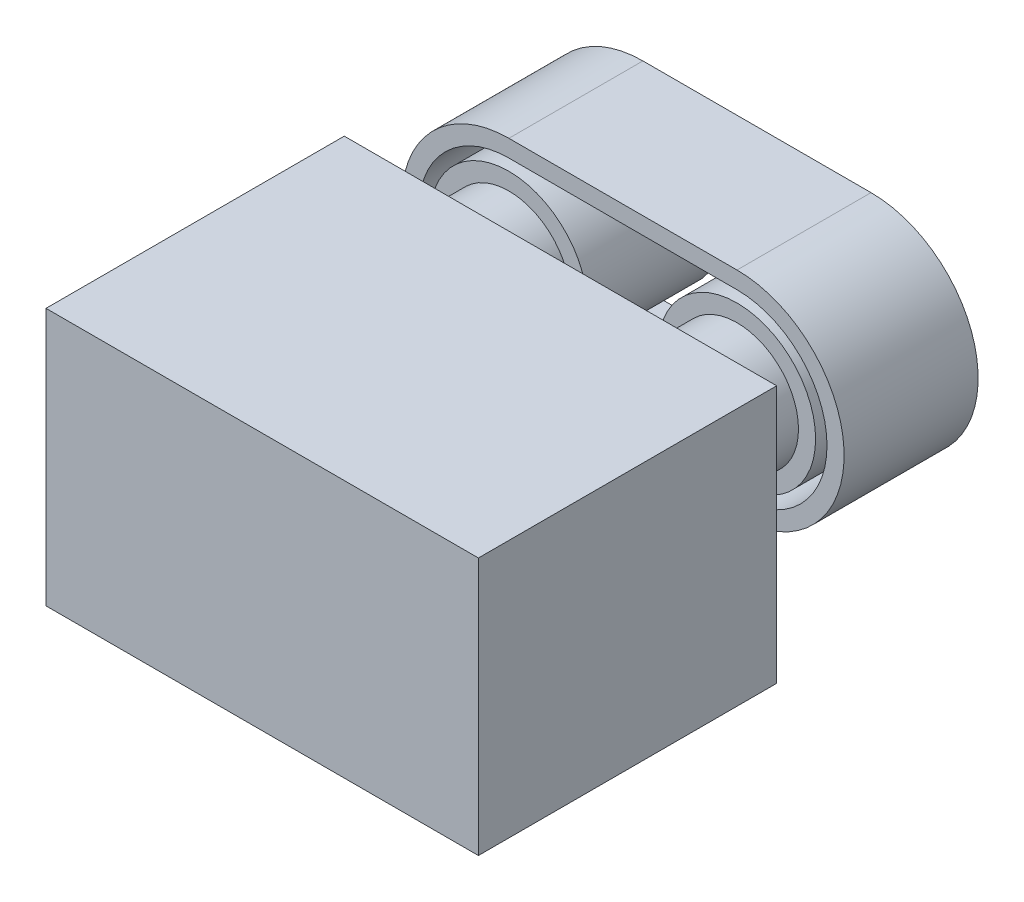
ISO-10303-21;
HEADER;
FILE_DESCRIPTION(('STEP AP214'),'2;1');
FILE_NAME('part.step','',(''),(''),'','','');
FILE_SCHEMA(('AUTOMOTIVE_DESIGN { 1 0 10303 214 1 1 1 1 }'));
ENDSEC;
DATA;
#1=APPLICATION_CONTEXT('core data for automotive mechanical design processes');
#2=APPLICATION_PROTOCOL_DEFINITION('international standard','automotive_design',2000,#1);
#3=PRODUCT_CONTEXT('',#1,'mechanical');
#4=PRODUCT('Part','Part','',(#3));
#5=PRODUCT_RELATED_PRODUCT_CATEGORY('part','',(#4));
#6=PRODUCT_DEFINITION_FORMATION('','',#4);
#7=PRODUCT_DEFINITION_CONTEXT('part definition',#1,'design');
#8=PRODUCT_DEFINITION('design','',#6,#7);
#9=PRODUCT_DEFINITION_SHAPE('','',#8);
#10=(LENGTH_UNIT() NAMED_UNIT(*) SI_UNIT(.MILLI.,.METRE.));
#11=(NAMED_UNIT(*) PLANE_ANGLE_UNIT() SI_UNIT($,.RADIAN.));
#12=(NAMED_UNIT(*) SI_UNIT($,.STERADIAN.) SOLID_ANGLE_UNIT());
#13=UNCERTAINTY_MEASURE_WITH_UNIT(LENGTH_MEASURE(1.E-05),#10,'distance_accuracy_value','');
#14=(GEOMETRIC_REPRESENTATION_CONTEXT(3) GLOBAL_UNCERTAINTY_ASSIGNED_CONTEXT((#13)) GLOBAL_UNIT_ASSIGNED_CONTEXT((#10,
#11,#12)) REPRESENTATION_CONTEXT('',''));
#15=CARTESIAN_POINT('',(0.,0.,0.));
#16=DIRECTION('',(0.,0.,1.));
#17=DIRECTION('',(1.,0.,0.));
#18=AXIS2_PLACEMENT_3D('',#15,#16,#17);
#19=CARTESIAN_POINT('',(129.580947854608,0.,59.69));
#20=DIRECTION('',(0.,0.,1.));
#21=DIRECTION('',(1.,0.,0.));
#22=AXIS2_PLACEMENT_3D('',#19,#20,#21);
#23=PLANE('',#22);
#24=CARTESIAN_POINT('',(129.580947854608,0.,59.69));
#25=DIRECTION('',(0.,0.,1.));
#26=DIRECTION('',(1.,0.,0.));
#27=AXIS2_PLACEMENT_3D('',#24,#25,#26);
#28=CIRCLE('',#27,47.7);
#29=CARTESIAN_POINT('',(129.580947854608,-47.7000000000001,59.69));
#30=VERTEX_POINT('',#29);
#31=CARTESIAN_POINT('',(129.580947854608,47.7,59.69));
#32=VERTEX_POINT('',#31);
#33=EDGE_CURVE('E146',#30,#32,#28,.T.);
#34=ORIENTED_EDGE('',*,*,#33,.T.);
#35=DIRECTION('',(-1.,0.,0.));
#36=VECTOR('',#35,1.);
#37=CARTESIAN_POINT('',(27.9809478546076,47.7,59.69));
#38=LINE('',#37,#36);
#39=CARTESIAN_POINT('',(27.9809478546076,47.7,59.69));
#40=VERTEX_POINT('',#39);
#41=EDGE_CURVE('E149',#32,#40,#38,.T.);
#42=ORIENTED_EDGE('',*,*,#41,.T.);
#43=CARTESIAN_POINT('',(27.9809478546076,0.,59.69));
#44=DIRECTION('',(0.,0.,1.));
#45=DIRECTION('',(1.,0.,0.));
#46=AXIS2_PLACEMENT_3D('',#43,#44,#45);
#47=CIRCLE('',#46,47.7);
#48=CARTESIAN_POINT('',(27.9809478546076,-47.7000000000001,59.69));
#49=VERTEX_POINT('',#48);
#50=EDGE_CURVE('E152',#40,#49,#47,.T.);
#51=ORIENTED_EDGE('',*,*,#50,.T.);
#52=DIRECTION('',(1.,0.,0.));
#53=VECTOR('',#52,1.);
#54=CARTESIAN_POINT('',(27.9809478546076,-47.7000000000001,59.69));
#55=LINE('',#54,#53);
#56=EDGE_CURVE('E154',#49,#30,#55,.T.);
#57=ORIENTED_EDGE('',*,*,#56,.T.);
#58=EDGE_LOOP('',(#34,#42,#51,#57));
#59=FACE_BOUND('',#58,.T.);
#60=DIRECTION('',(1.,0.,0.));
#61=VECTOR('',#60,1.);
#62=CARTESIAN_POINT('',(27.9809478546076,-40.08,59.69));
#63=LINE('',#62,#61);
#64=CARTESIAN_POINT('',(27.9809478546076,-40.08,59.69));
#65=VERTEX_POINT('',#64);
#66=CARTESIAN_POINT('',(129.580947854608,-40.0800000000001,59.69));
#67=VERTEX_POINT('',#66);
#68=EDGE_CURVE('E118',#65,#67,#63,.T.);
#69=ORIENTED_EDGE('',*,*,#68,.F.);
#70=CARTESIAN_POINT('',(27.9809478546076,0.,59.69));
#71=DIRECTION('',(0.,0.,1.));
#72=DIRECTION('',(1.,0.,0.));
#73=AXIS2_PLACEMENT_3D('',#70,#71,#72);
#74=CIRCLE('',#73,40.08);
#75=CARTESIAN_POINT('',(27.9809478546076,40.08,59.69));
#76=VERTEX_POINT('',#75);
#77=EDGE_CURVE('E110',#76,#65,#74,.T.);
#78=ORIENTED_EDGE('',*,*,#77,.F.);
#79=DIRECTION('',(-1.,0.,0.));
#80=VECTOR('',#79,1.);
#81=CARTESIAN_POINT('',(27.9809478546076,40.08,59.69));
#82=LINE('',#81,#80);
#83=CARTESIAN_POINT('',(129.580947854608,40.08,59.69));
#84=VERTEX_POINT('',#83);
#85=EDGE_CURVE('E132',#84,#76,#82,.T.);
#86=ORIENTED_EDGE('',*,*,#85,.F.);
#87=CARTESIAN_POINT('',(129.580947854608,0.,59.69));
#88=DIRECTION('',(0.,0.,1.));
#89=DIRECTION('',(1.,0.,0.));
#90=AXIS2_PLACEMENT_3D('',#87,#88,#89);
#91=CIRCLE('',#90,40.08);
#92=EDGE_CURVE('E130',#67,#84,#91,.T.);
#93=ORIENTED_EDGE('',*,*,#92,.F.);
#94=EDGE_LOOP('',(#69,#78,#86,#93));
#95=FACE_BOUND('',#94,.T.);
#96=ADVANCED_FACE('F45',(#59,#95),#23,.T.);
#97=CARTESIAN_POINT('',(129.580947854608,0.,0.));
#98=DIRECTION('',(0.,0.,1.));
#99=DIRECTION('',(1.,0.,0.));
#100=AXIS2_PLACEMENT_3D('',#97,#98,#99);
#101=PLANE('',#100);
#102=CARTESIAN_POINT('',(129.580947854608,0.,0.));
#103=DIRECTION('',(0.,0.,1.));
#104=DIRECTION('',(1.,0.,0.));
#105=AXIS2_PLACEMENT_3D('',#102,#103,#104);
#106=CIRCLE('',#105,47.7);
#107=CARTESIAN_POINT('',(129.580947854608,-47.7000000000001,0.));
#108=VERTEX_POINT('',#107);
#109=CARTESIAN_POINT('',(129.580947854608,47.7,0.));
#110=VERTEX_POINT('',#109);
#111=EDGE_CURVE('E126',#108,#110,#106,.T.);
#112=ORIENTED_EDGE('',*,*,#111,.F.);
#113=DIRECTION('',(1.,0.,0.));
#114=VECTOR('',#113,1.);
#115=CARTESIAN_POINT('',(27.9809478546076,-47.7000000000001,0.));
#116=LINE('',#115,#114);
#117=CARTESIAN_POINT('',(27.9809478546076,-47.7000000000001,0.));
#118=VERTEX_POINT('',#117);
#119=EDGE_CURVE('E150',#118,#108,#116,.T.);
#120=ORIENTED_EDGE('',*,*,#119,.F.);
#121=CARTESIAN_POINT('',(27.9809478546076,0.,0.));
#122=DIRECTION('',(0.,0.,1.));
#123=DIRECTION('',(1.,0.,0.));
#124=AXIS2_PLACEMENT_3D('',#121,#122,#123);
#125=CIRCLE('',#124,47.7);
#126=CARTESIAN_POINT('',(27.9809478546076,47.7,0.));
#127=VERTEX_POINT('',#126);
#128=EDGE_CURVE('E161',#127,#118,#125,.T.);
#129=ORIENTED_EDGE('',*,*,#128,.F.);
#130=DIRECTION('',(-1.,0.,0.));
#131=VECTOR('',#130,1.);
#132=CARTESIAN_POINT('',(27.9809478546076,47.7,0.));
#133=LINE('',#132,#131);
#134=EDGE_CURVE('E159',#110,#127,#133,.T.);
#135=ORIENTED_EDGE('',*,*,#134,.F.);
#136=EDGE_LOOP('',(#112,#120,#129,#135));
#137=FACE_BOUND('',#136,.T.);
#138=CARTESIAN_POINT('',(27.9809478546076,0.,0.));
#139=DIRECTION('',(0.,0.,1.));
#140=DIRECTION('',(1.,0.,0.));
#141=AXIS2_PLACEMENT_3D('',#138,#139,#140);
#142=CIRCLE('',#141,40.08);
#143=CARTESIAN_POINT('',(27.9809478546076,40.08,0.));
#144=VERTEX_POINT('',#143);
#145=CARTESIAN_POINT('',(27.9809478546076,-40.08,0.));
#146=VERTEX_POINT('',#145);
#147=EDGE_CURVE('E68',#144,#146,#142,.T.);
#148=ORIENTED_EDGE('',*,*,#147,.T.);
#149=DIRECTION('',(1.,0.,0.));
#150=VECTOR('',#149,1.);
#151=CARTESIAN_POINT('',(27.9809478546076,-40.08,0.));
#152=LINE('',#151,#150);
#153=CARTESIAN_POINT('',(129.580947854608,-40.0800000000001,0.));
#154=VERTEX_POINT('',#153);
#155=EDGE_CURVE('E125',#146,#154,#152,.T.);
#156=ORIENTED_EDGE('',*,*,#155,.T.);
#157=CARTESIAN_POINT('',(129.580947854608,0.,0.));
#158=DIRECTION('',(0.,0.,1.));
#159=DIRECTION('',(1.,0.,0.));
#160=AXIS2_PLACEMENT_3D('',#157,#158,#159);
#161=CIRCLE('',#160,40.08);
#162=CARTESIAN_POINT('',(129.580947854608,40.08,0.));
#163=VERTEX_POINT('',#162);
#164=EDGE_CURVE('E138',#154,#163,#161,.T.);
#165=ORIENTED_EDGE('',*,*,#164,.T.);
#166=DIRECTION('',(-1.,0.,0.));
#167=VECTOR('',#166,1.);
#168=CARTESIAN_POINT('',(27.9809478546076,40.08,0.));
#169=LINE('',#168,#167);
#170=EDGE_CURVE('E119',#163,#144,#169,.T.);
#171=ORIENTED_EDGE('',*,*,#170,.T.);
#172=EDGE_LOOP('',(#148,#156,#165,#171));
#173=FACE_BOUND('',#172,.T.);
#174=ADVANCED_FACE('F179',(#137,#173),#101,.F.);
#175=CARTESIAN_POINT('',(129.580947854608,0.,59.69));
#176=DIRECTION('',(0.,0.,-1.));
#177=DIRECTION('',(-1.,0.,0.));
#178=AXIS2_PLACEMENT_3D('',#175,#176,#177);
#179=CYLINDRICAL_SURFACE('',#178,47.7);
#180=ORIENTED_EDGE('',*,*,#111,.T.);
#181=DIRECTION('',(0.,0.,-1.));
#182=VECTOR('',#181,1.);
#183=CARTESIAN_POINT('',(129.580947854608,47.7,59.69));
#184=LINE('',#183,#182);
#185=EDGE_CURVE('E12',#32,#110,#184,.T.);
#186=ORIENTED_EDGE('',*,*,#185,.F.);
#187=ORIENTED_EDGE('',*,*,#33,.F.);
#188=DIRECTION('',(0.,0.,-1.));
#189=VECTOR('',#188,1.);
#190=CARTESIAN_POINT('',(129.580947854608,-47.7000000000001,59.69));
#191=LINE('',#190,#189);
#192=EDGE_CURVE('E156',#30,#108,#191,.T.);
#193=ORIENTED_EDGE('',*,*,#192,.T.);
#194=EDGE_LOOP('',(#180,#186,#187,#193));
#195=FACE_BOUND('',#194,.T.);
#196=ADVANCED_FACE('F47',(#195),#179,.T.);
#197=CARTESIAN_POINT('',(27.9809478546076,47.7,59.69));
#198=DIRECTION('',(0.,-1.,0.));
#199=DIRECTION('',(1.,0.,0.));
#200=AXIS2_PLACEMENT_3D('',#197,#198,#199);
#201=PLANE('',#200);
#202=ORIENTED_EDGE('',*,*,#134,.T.);
#203=DIRECTION('',(0.,0.,-1.));
#204=VECTOR('',#203,1.);
#205=CARTESIAN_POINT('',(27.9809478546076,47.7,59.69));
#206=LINE('',#205,#204);
#207=EDGE_CURVE('E53',#40,#127,#206,.T.);
#208=ORIENTED_EDGE('',*,*,#207,.F.);
#209=ORIENTED_EDGE('',*,*,#41,.F.);
#210=ORIENTED_EDGE('',*,*,#185,.T.);
#211=EDGE_LOOP('',(#202,#208,#209,#210));
#212=FACE_BOUND('',#211,.T.);
#213=ADVANCED_FACE('F189',(#212),#201,.F.);
#214=CARTESIAN_POINT('',(27.9809478546076,0.,59.69));
#215=DIRECTION('',(0.,0.,-1.));
#216=DIRECTION('',(-1.,0.,0.));
#217=AXIS2_PLACEMENT_3D('',#214,#215,#216);
#218=CYLINDRICAL_SURFACE('',#217,47.7);
#219=ORIENTED_EDGE('',*,*,#128,.T.);
#220=DIRECTION('',(0.,0.,-1.));
#221=VECTOR('',#220,1.);
#222=CARTESIAN_POINT('',(27.9809478546076,-47.7000000000001,59.69));
#223=LINE('',#222,#221);
#224=EDGE_CURVE('E166',#49,#118,#223,.T.);
#225=ORIENTED_EDGE('',*,*,#224,.F.);
#226=ORIENTED_EDGE('',*,*,#50,.F.);
#227=ORIENTED_EDGE('',*,*,#207,.T.);
#228=EDGE_LOOP('',(#219,#225,#226,#227));
#229=FACE_BOUND('',#228,.T.);
#230=ADVANCED_FACE('F173',(#229),#218,.T.);
#231=CARTESIAN_POINT('',(27.9809478546076,-47.7000000000001,59.69));
#232=DIRECTION('',(0.,1.,0.));
#233=DIRECTION('',(-1.,0.,0.));
#234=AXIS2_PLACEMENT_3D('',#231,#232,#233);
#235=PLANE('',#234);
#236=ORIENTED_EDGE('',*,*,#119,.T.);
#237=ORIENTED_EDGE('',*,*,#192,.F.);
#238=ORIENTED_EDGE('',*,*,#56,.F.);
#239=ORIENTED_EDGE('',*,*,#224,.T.);
#240=EDGE_LOOP('',(#236,#237,#238,#239));
#241=FACE_BOUND('',#240,.T.);
#242=ADVANCED_FACE('F183',(#241),#235,.F.);
#243=CARTESIAN_POINT('',(27.9809478546076,0.,59.69));
#244=DIRECTION('',(0.,0.,-1.));
#245=DIRECTION('',(-1.,0.,0.));
#246=AXIS2_PLACEMENT_3D('',#243,#244,#245);
#247=CYLINDRICAL_SURFACE('',#246,40.08);
#248=ORIENTED_EDGE('',*,*,#147,.F.);
#249=DIRECTION('',(0.,0.,-1.));
#250=VECTOR('',#249,1.);
#251=CARTESIAN_POINT('',(27.9809478546076,40.08,59.69));
#252=LINE('',#251,#250);
#253=EDGE_CURVE('E114',#76,#144,#252,.T.);
#254=ORIENTED_EDGE('',*,*,#253,.F.);
#255=ORIENTED_EDGE('',*,*,#77,.T.);
#256=DIRECTION('',(0.,0.,-1.));
#257=VECTOR('',#256,1.);
#258=CARTESIAN_POINT('',(27.9809478546076,-40.08,59.69));
#259=LINE('',#258,#257);
#260=EDGE_CURVE('E113',#65,#146,#259,.T.);
#261=ORIENTED_EDGE('',*,*,#260,.T.);
#262=EDGE_LOOP('',(#248,#254,#255,#261));
#263=FACE_BOUND('',#262,.T.);
#264=ADVANCED_FACE('F112',(#263),#247,.F.);
#265=CARTESIAN_POINT('',(27.9809478546076,-40.08,59.69));
#266=DIRECTION('',(0.,1.,0.));
#267=DIRECTION('',(-1.,0.,0.));
#268=AXIS2_PLACEMENT_3D('',#265,#266,#267);
#269=PLANE('',#268);
#270=ORIENTED_EDGE('',*,*,#155,.F.);
#271=ORIENTED_EDGE('',*,*,#260,.F.);
#272=ORIENTED_EDGE('',*,*,#68,.T.);
#273=DIRECTION('',(0.,0.,-1.));
#274=VECTOR('',#273,1.);
#275=CARTESIAN_POINT('',(129.580947854608,-40.0800000000001,59.69));
#276=LINE('',#275,#274);
#277=EDGE_CURVE('E127',#67,#154,#276,.T.);
#278=ORIENTED_EDGE('',*,*,#277,.T.);
#279=EDGE_LOOP('',(#270,#271,#272,#278));
#280=FACE_BOUND('',#279,.T.);
#281=ADVANCED_FACE('F122',(#280),#269,.T.);
#282=CARTESIAN_POINT('',(129.580947854608,0.,59.69));
#283=DIRECTION('',(0.,0.,-1.));
#284=DIRECTION('',(-1.,0.,0.));
#285=AXIS2_PLACEMENT_3D('',#282,#283,#284);
#286=CYLINDRICAL_SURFACE('',#285,40.08);
#287=ORIENTED_EDGE('',*,*,#164,.F.);
#288=ORIENTED_EDGE('',*,*,#277,.F.);
#289=ORIENTED_EDGE('',*,*,#92,.T.);
#290=DIRECTION('',(0.,0.,-1.));
#291=VECTOR('',#290,1.);
#292=CARTESIAN_POINT('',(129.580947854608,40.08,59.69));
#293=LINE('',#292,#291);
#294=EDGE_CURVE('E60',#84,#163,#293,.T.);
#295=ORIENTED_EDGE('',*,*,#294,.T.);
#296=EDGE_LOOP('',(#287,#288,#289,#295));
#297=FACE_BOUND('',#296,.T.);
#298=ADVANCED_FACE('F212',(#297),#286,.F.);
#299=CARTESIAN_POINT('',(27.9809478546076,40.08,59.69));
#300=DIRECTION('',(0.,-1.,0.));
#301=DIRECTION('',(1.,0.,0.));
#302=AXIS2_PLACEMENT_3D('',#299,#300,#301);
#303=PLANE('',#302);
#304=ORIENTED_EDGE('',*,*,#170,.F.);
#305=ORIENTED_EDGE('',*,*,#294,.F.);
#306=ORIENTED_EDGE('',*,*,#85,.T.);
#307=ORIENTED_EDGE('',*,*,#253,.T.);
#308=EDGE_LOOP('',(#304,#305,#306,#307));
#309=FACE_BOUND('',#308,.T.);
#310=ADVANCED_FACE('F216',(#309),#303,.T.);
#311=CLOSED_SHELL('',(#96,#174,#196,#213,#230,#242,#264,#281,#298,#310));
#312=MANIFOLD_SOLID_BREP('B2',#311);
#313=CARTESIAN_POINT('',(-112.093411713347,-82.5676000219053,212.852));
#314=DIRECTION('',(0.,1.,0.));
#315=DIRECTION('',(0.,0.,1.));
#316=AXIS2_PLACEMENT_3D('',#313,#314,#315);
#317=PLANE('',#316);
#318=DIRECTION('',(1.,0.,0.));
#319=VECTOR('',#318,1.);
#320=CARTESIAN_POINT('',(-112.093411713347,-82.5676000219053,212.852));
#321=LINE('',#320,#319);
#322=CARTESIAN_POINT('',(-25.0134658406247,-82.5676000219053,212.852));
#323=VERTEX_POINT('',#322);
#324=CARTESIAN_POINT('',(167.571039973753,-82.5676000219053,212.852));
#325=VERTEX_POINT('',#324);
#326=EDGE_CURVE('E329',#323,#325,#321,.T.);
#327=ORIENTED_EDGE('',*,*,#326,.F.);
#328=DIRECTION('',(0.,0.,-1.));
#329=VECTOR('',#328,1.);
#330=CARTESIAN_POINT('',(-25.0134658406247,-82.5676000219053,212.852));
#331=LINE('',#330,#329);
#332=CARTESIAN_POINT('',(-25.0134658406247,-82.5676000219053,80.01));
#333=VERTEX_POINT('',#332);
#334=EDGE_CURVE('E383',#323,#333,#331,.T.);
#335=ORIENTED_EDGE('',*,*,#334,.T.);
#336=DIRECTION('',(1.,0.,0.));
#337=VECTOR('',#336,1.);
#338=CARTESIAN_POINT('',(-112.093411713347,-82.5676000219053,80.01));
#339=LINE('',#338,#337);
#340=CARTESIAN_POINT('',(167.571039973753,-82.5676000219053,80.01));
#341=VERTEX_POINT('',#340);
#342=EDGE_CURVE('E321',#333,#341,#339,.T.);
#343=ORIENTED_EDGE('',*,*,#342,.T.);
#344=DIRECTION('',(0.,0.,-1.));
#345=VECTOR('',#344,1.);
#346=CARTESIAN_POINT('',(167.571039973753,-82.5676000219053,212.852));
#347=LINE('',#346,#345);
#348=EDGE_CURVE('E316',#325,#341,#347,.T.);
#349=ORIENTED_EDGE('',*,*,#348,.F.);
#350=EDGE_LOOP('',(#327,#335,#343,#349));
#351=FACE_BOUND('',#350,.T.);
#352=ADVANCED_FACE('F275',(#351),#317,.F.);
#353=CARTESIAN_POINT('',(167.571039973753,0.,212.852));
#354=DIRECTION('',(-1.,0.,0.));
#355=DIRECTION('',(0.,0.,1.));
#356=AXIS2_PLACEMENT_3D('',#353,#354,#355);
#357=PLANE('',#356);
#358=DIRECTION('',(0.,1.,0.));
#359=VECTOR('',#358,1.);
#360=CARTESIAN_POINT('',(167.571039973753,0.,80.01));
#361=LINE('',#360,#359);
#362=CARTESIAN_POINT('',(167.571039973753,32.2037853457875,80.01));
#363=VERTEX_POINT('',#362);
#364=EDGE_CURVE('E310',#341,#363,#361,.T.);
#365=ORIENTED_EDGE('',*,*,#364,.T.);
#366=DIRECTION('',(0.,0.,-1.));
#367=VECTOR('',#366,1.);
#368=CARTESIAN_POINT('',(167.571039973753,32.2037853457875,212.852));
#369=LINE('',#368,#367);
#370=CARTESIAN_POINT('',(167.571039973753,32.2037853457875,212.852));
#371=VERTEX_POINT('',#370);
#372=EDGE_CURVE('E313',#371,#363,#369,.T.);
#373=ORIENTED_EDGE('',*,*,#372,.F.);
#374=DIRECTION('',(0.,1.,0.));
#375=VECTOR('',#374,1.);
#376=CARTESIAN_POINT('',(167.571039973753,0.,212.852));
#377=LINE('',#376,#375);
#378=EDGE_CURVE('E297',#325,#371,#377,.T.);
#379=ORIENTED_EDGE('',*,*,#378,.F.);
#380=ORIENTED_EDGE('',*,*,#348,.T.);
#381=EDGE_LOOP('',(#365,#373,#379,#380));
#382=FACE_BOUND('',#381,.T.);
#383=ADVANCED_FACE('F312',(#382),#357,.F.);
#384=CARTESIAN_POINT('',(167.571039973753,32.2037853457875,212.852));
#385=DIRECTION('',(0.,-1.,0.));
#386=DIRECTION('',(0.,0.,-1.));
#387=AXIS2_PLACEMENT_3D('',#384,#385,#386);
#388=PLANE('',#387);
#389=DIRECTION('',(-1.,0.,0.));
#390=VECTOR('',#389,1.);
#391=CARTESIAN_POINT('',(167.571039973753,32.2037853457875,80.01));
#392=LINE('',#391,#390);
#393=CARTESIAN_POINT('',(-25.0134658406247,32.2037853457875,80.01));
#394=VERTEX_POINT('',#393);
#395=EDGE_CURVE('E320',#363,#394,#392,.T.);
#396=ORIENTED_EDGE('',*,*,#395,.T.);
#397=DIRECTION('',(0.,0.,1.));
#398=VECTOR('',#397,1.);
#399=CARTESIAN_POINT('',(-25.0134658406247,32.2037853457875,212.852));
#400=LINE('',#399,#398);
#401=CARTESIAN_POINT('',(-25.0134658406247,32.2037853457875,212.852));
#402=VERTEX_POINT('',#401);
#403=EDGE_CURVE('E289',#394,#402,#400,.T.);
#404=ORIENTED_EDGE('',*,*,#403,.T.);
#405=DIRECTION('',(-1.,0.,0.));
#406=VECTOR('',#405,1.);
#407=CARTESIAN_POINT('',(167.571039973753,32.2037853457875,212.852));
#408=LINE('',#407,#406);
#409=EDGE_CURVE('E326',#371,#402,#408,.T.);
#410=ORIENTED_EDGE('',*,*,#409,.F.);
#411=ORIENTED_EDGE('',*,*,#372,.T.);
#412=EDGE_LOOP('',(#396,#404,#410,#411));
#413=FACE_BOUND('',#412,.T.);
#414=ADVANCED_FACE('F325',(#413),#388,.F.);
#415=CARTESIAN_POINT('',(0.,0.,212.852));
#416=DIRECTION('',(0.,0.,1.));
#417=DIRECTION('',(1.,0.,0.));
#418=AXIS2_PLACEMENT_3D('',#415,#416,#417);
#419=PLANE('',#418);
#420=DIRECTION('',(0.,1.,0.));
#421=VECTOR('',#420,1.);
#422=CARTESIAN_POINT('',(-25.0134658406247,0.,212.852));
#423=LINE('',#422,#421);
#424=EDGE_CURVE('E375',#323,#402,#423,.T.);
#425=ORIENTED_EDGE('',*,*,#424,.F.);
#426=ORIENTED_EDGE('',*,*,#326,.T.);
#427=ORIENTED_EDGE('',*,*,#378,.T.);
#428=ORIENTED_EDGE('',*,*,#409,.T.);
#429=EDGE_LOOP('',(#425,#426,#427,#428));
#430=FACE_BOUND('',#429,.T.);
#431=ADVANCED_FACE('F346',(#430),#419,.T.);
#432=CARTESIAN_POINT('',(0.,0.,80.01));
#433=DIRECTION('',(0.,0.,1.));
#434=DIRECTION('',(1.,0.,0.));
#435=AXIS2_PLACEMENT_3D('',#432,#433,#434);
#436=PLANE('',#435);
#437=CARTESIAN_POINT('',(129.580947854608,0.,80.01));
#438=DIRECTION('',(0.,0.,1.));
#439=DIRECTION('',(1.,0.,0.));
#440=AXIS2_PLACEMENT_3D('',#437,#438,#439);
#441=CIRCLE('',#440,27.38);
#442=CARTESIAN_POINT('',(156.960947854608,0.,80.01));
#443=VERTEX_POINT('',#442);
#444=EDGE_CURVE('E282',#443,#443,#441,.F.);
#445=ORIENTED_EDGE('',*,*,#444,.F.);
#446=EDGE_LOOP('',(#445));
#447=FACE_BOUND('',#446,.T.);
#448=CARTESIAN_POINT('',(27.9809478546076,0.,80.01));
#449=DIRECTION('',(0.,0.,1.));
#450=DIRECTION('',(1.,0.,0.));
#451=AXIS2_PLACEMENT_3D('',#448,#449,#450);
#452=CIRCLE('',#451,27.38);
#453=CARTESIAN_POINT('',(55.3609478546076,0.,80.01));
#454=VERTEX_POINT('',#453);
#455=EDGE_CURVE('E335',#454,#454,#452,.F.);
#456=ORIENTED_EDGE('',*,*,#455,.F.);
#457=EDGE_LOOP('',(#456));
#458=FACE_BOUND('',#457,.T.);
#459=ORIENTED_EDGE('',*,*,#342,.F.);
#460=DIRECTION('',(0.,1.,0.));
#461=VECTOR('',#460,1.);
#462=CARTESIAN_POINT('',(-25.0134658406247,0.,80.01));
#463=LINE('',#462,#461);
#464=EDGE_CURVE('E43',#333,#394,#463,.T.);
#465=ORIENTED_EDGE('',*,*,#464,.T.);
#466=ORIENTED_EDGE('',*,*,#395,.F.);
#467=ORIENTED_EDGE('',*,*,#364,.F.);
#468=EDGE_LOOP('',(#459,#465,#466,#467));
#469=FACE_BOUND('',#468,.T.);
#470=ADVANCED_FACE('F328',(#447,#458,#469),#436,.F.);
#471=CARTESIAN_POINT('',(27.9809478546076,0.,59.69));
#472=DIRECTION('',(0.,0.,-1.));
#473=DIRECTION('',(-1.,0.,0.));
#474=AXIS2_PLACEMENT_3D('',#471,#472,#473);
#475=CYLINDRICAL_SURFACE('',#474,35.);
#476=CARTESIAN_POINT('',(27.9809478546076,0.,59.69));
#477=DIRECTION('',(0.,0.,1.));
#478=DIRECTION('',(1.,0.,0.));
#479=AXIS2_PLACEMENT_3D('',#476,#477,#478);
#480=CIRCLE('',#479,35.);
#481=CARTESIAN_POINT('',(-7.01905214539237,0.,59.69));
#482=VERTEX_POINT('',#481);
#483=EDGE_CURVE('E360',#482,#482,#480,.T.);
#484=CARTESIAN_POINT('',(27.9809478546076,0.,0.));
#485=DIRECTION('',(0.,0.,1.));
#486=DIRECTION('',(1.,0.,0.));
#487=AXIS2_PLACEMENT_3D('',#484,#485,#486);
#488=CIRCLE('',#487,35.);
#489=CARTESIAN_POINT('',(-7.01905214539237,0.,0.));
#490=VERTEX_POINT('',#489);
#491=EDGE_CURVE('E363',#490,#490,#488,.T.);
#492=CARTESIAN_POINT('',(-7.01905214539237,0.,59.69));
#493=CARTESIAN_POINT('',(-7.01905214539237,0.,59.0682291666667));
#494=CARTESIAN_POINT('',(-7.01905214539237,0.,58.4464583333333));
#495=CARTESIAN_POINT('',(-7.01905214539237,0.,57.2029166666667));
#496=CARTESIAN_POINT('',(-7.01905214539237,0.,56.5811458333333));
#497=CARTESIAN_POINT('',(-7.01905214539237,0.,55.3376041666667));
#498=CARTESIAN_POINT('',(-7.01905214539237,0.,54.7158333333333));
#499=CARTESIAN_POINT('',(-7.01905214539237,0.,53.4722916666667));
#500=CARTESIAN_POINT('',(-7.01905214539237,0.,52.8505208333333));
#501=CARTESIAN_POINT('',(-7.01905214539237,0.,51.6069791666667));
#502=CARTESIAN_POINT('',(-7.01905214539237,0.,50.9852083333333));
#503=CARTESIAN_POINT('',(-7.01905214539237,0.,49.7416666666667));
#504=CARTESIAN_POINT('',(-7.01905214539237,0.,49.1198958333333));
#505=CARTESIAN_POINT('',(-7.01905214539237,0.,47.8763541666667));
#506=CARTESIAN_POINT('',(-7.01905214539237,0.,47.2545833333333));
#507=CARTESIAN_POINT('',(-7.01905214539237,0.,46.0110416666667));
#508=CARTESIAN_POINT('',(-7.01905214539237,0.,45.3892708333333));
#509=CARTESIAN_POINT('',(-7.01905214539237,0.,44.1457291666667));
#510=CARTESIAN_POINT('',(-7.01905214539237,0.,43.5239583333333));
#511=CARTESIAN_POINT('',(-7.01905214539237,0.,42.2804166666667));
#512=CARTESIAN_POINT('',(-7.01905214539237,0.,41.6586458333333));
#513=CARTESIAN_POINT('',(-7.01905214539237,0.,40.4151041666667));
#514=CARTESIAN_POINT('',(-7.01905214539237,0.,39.7933333333333));
#515=CARTESIAN_POINT('',(-7.01905214539237,0.,38.5497916666667));
#516=CARTESIAN_POINT('',(-7.01905214539237,0.,37.9280208333333));
#517=CARTESIAN_POINT('',(-7.01905214539237,0.,36.6844791666667));
#518=CARTESIAN_POINT('',(-7.01905214539237,0.,36.0627083333333));
#519=CARTESIAN_POINT('',(-7.01905214539237,0.,34.8191666666667));
#520=CARTESIAN_POINT('',(-7.01905214539237,0.,34.1973958333333));
#521=CARTESIAN_POINT('',(-7.01905214539237,0.,32.9538541666667));
#522=CARTESIAN_POINT('',(-7.01905214539237,0.,32.3320833333333));
#523=CARTESIAN_POINT('',(-7.01905214539237,0.,31.0885416666667));
#524=CARTESIAN_POINT('',(-7.01905214539237,0.,30.4667708333333));
#525=CARTESIAN_POINT('',(-7.01905214539237,0.,29.2232291666667));
#526=CARTESIAN_POINT('',(-7.01905214539237,0.,28.6014583333333));
#527=CARTESIAN_POINT('',(-7.01905214539237,0.,27.3579166666667));
#528=CARTESIAN_POINT('',(-7.01905214539237,0.,26.7361458333333));
#529=CARTESIAN_POINT('',(-7.01905214539237,0.,25.4926041666667));
#530=CARTESIAN_POINT('',(-7.01905214539237,0.,24.8708333333333));
#531=CARTESIAN_POINT('',(-7.01905214539237,0.,23.6272916666667));
#532=CARTESIAN_POINT('',(-7.01905214539237,0.,23.0055208333333));
#533=CARTESIAN_POINT('',(-7.01905214539237,0.,21.7619791666667));
#534=CARTESIAN_POINT('',(-7.01905214539237,0.,21.1402083333333));
#535=CARTESIAN_POINT('',(-7.01905214539237,0.,19.8966666666667));
#536=CARTESIAN_POINT('',(-7.01905214539237,0.,19.2748958333333));
#537=CARTESIAN_POINT('',(-7.01905214539237,0.,18.0313541666667));
#538=CARTESIAN_POINT('',(-7.01905214539237,0.,17.4095833333333));
#539=CARTESIAN_POINT('',(-7.01905214539237,0.,16.1660416666667));
#540=CARTESIAN_POINT('',(-7.01905214539237,0.,15.5442708333333));
#541=CARTESIAN_POINT('',(-7.01905214539237,0.,14.3007291666667));
#542=CARTESIAN_POINT('',(-7.01905214539237,0.,13.6789583333333));
#543=CARTESIAN_POINT('',(-7.01905214539237,0.,12.4354166666667));
#544=CARTESIAN_POINT('',(-7.01905214539237,0.,11.8136458333333));
#545=CARTESIAN_POINT('',(-7.01905214539237,0.,10.5701041666667));
#546=CARTESIAN_POINT('',(-7.01905214539237,0.,9.94833333333334));
#547=CARTESIAN_POINT('',(-7.01905214539237,0.,8.70479166666667));
#548=CARTESIAN_POINT('',(-7.01905214539237,0.,8.08302083333334));
#549=CARTESIAN_POINT('',(-7.01905214539237,0.,6.83947916666667));
#550=CARTESIAN_POINT('',(-7.01905214539237,0.,6.21770833333334));
#551=CARTESIAN_POINT('',(-7.01905214539237,0.,4.97416666666667));
#552=CARTESIAN_POINT('',(-7.01905214539237,0.,4.35239583333334));
#553=CARTESIAN_POINT('',(-7.01905214539237,0.,3.10885416666667));
#554=CARTESIAN_POINT('',(-7.01905214539237,0.,2.48708333333333));
#555=CARTESIAN_POINT('',(-7.01905214539237,0.,1.24354166666667));
#556=CARTESIAN_POINT('',(-7.01905214539237,0.,0.621770833333333));
#557=CARTESIAN_POINT('',(-7.01905214539237,0.,0.));
#558=B_SPLINE_CURVE_WITH_KNOTS('',3,(#492,#493,#494,#495,#496,#497,#498,#499,#500,#501,#502,
#503,#504,#505,#506,#507,#508,#509,#510,#511,#512,#513,#514,#515,#516,#517,#518,#519,#520,#521,
#522,#523,#524,#525,#526,#527,#528,#529,#530,#531,#532,#533,#534,#535,#536,#537,#538,#539,#540,
#541,#542,#543,#544,#545,#546,#547,#548,#549,#550,#551,#552,#553,#554,#555,#556,#557),
.UNSPECIFIED.,.F.,.F.,(4,2,2,2,2,2,2,2,2,2,2,2,2,2,2,2,2,2,2,2,2,2,2,2,2,2,2,2,2,2,2,2,4),(0.,
1.86531249999999,3.73062499999999,5.5959375,7.46125,9.3265625,11.191875,13.0571875,14.9225,
16.7878125,18.653125,20.5184375,22.38375,24.2490625,26.114375,27.9796875,29.845,31.7103125,
33.575625,35.4409375,37.30625,39.1715625,41.036875,42.9021875,44.7675,46.6328125,48.498125,
50.3634375,52.22875,54.0940625,55.959375,57.8246875,59.69),.UNSPECIFIED.);
#559=EDGE_CURVE('BSEAM345',#482,#490,#558,.T.);
#560=ORIENTED_EDGE('',*,*,#483,.F.);
#561=ORIENTED_EDGE('',*,*,#491,.T.);
#562=ORIENTED_EDGE('',*,*,#559,.T.);
#563=ORIENTED_EDGE('',*,*,#559,.F.);
#564=EDGE_LOOP('',(#560,#562,#561,#563));
#565=FACE_BOUND('',#564,.T.);
#566=ADVANCED_FACE('F345',(#565),#475,.T.);
#567=CARTESIAN_POINT('',(27.9809478546076,0.,59.69));
#568=DIRECTION('',(0.,0.,1.));
#569=DIRECTION('',(1.,0.,0.));
#570=AXIS2_PLACEMENT_3D('',#567,#568,#569);
#571=PLANE('',#570);
#572=CARTESIAN_POINT('',(27.9809478546076,0.,59.69));
#573=DIRECTION('',(0.,0.,1.));
#574=DIRECTION('',(1.,0.,0.));
#575=AXIS2_PLACEMENT_3D('',#572,#573,#574);
#576=CIRCLE('',#575,27.38);
#577=CARTESIAN_POINT('',(55.3609478546076,0.,59.69));
#578=VERTEX_POINT('',#577);
#579=EDGE_CURVE('E358',#578,#578,#576,.T.);
#580=ORIENTED_EDGE('',*,*,#579,.F.);
#581=EDGE_LOOP('',(#580));
#582=FACE_BOUND('',#581,.T.);
#583=ORIENTED_EDGE('',*,*,#483,.T.);
#584=EDGE_LOOP('',(#583));
#585=FACE_BOUND('',#584,.T.);
#586=ADVANCED_FACE('F425',(#582,#585),#571,.T.);
#587=CARTESIAN_POINT('',(27.9809478546076,0.,0.));
#588=DIRECTION('',(0.,0.,1.));
#589=DIRECTION('',(1.,0.,0.));
#590=AXIS2_PLACEMENT_3D('',#587,#588,#589);
#591=PLANE('',#590);
#592=ORIENTED_EDGE('',*,*,#491,.F.);
#593=EDGE_LOOP('',(#592));
#594=FACE_BOUND('',#593,.T.);
#595=ADVANCED_FACE('F354',(#594),#591,.F.);
#596=CARTESIAN_POINT('',(27.9809478546076,0.,80.01));
#597=DIRECTION('',(0.,0.,-1.));
#598=DIRECTION('',(-1.,0.,0.));
#599=AXIS2_PLACEMENT_3D('',#596,#597,#598);
#600=CYLINDRICAL_SURFACE('',#599,27.38);
#601=ORIENTED_EDGE('',*,*,#455,.T.);
#602=EDGE_LOOP('',(#601));
#603=FACE_BOUND('',#602,.T.);
#604=ORIENTED_EDGE('',*,*,#579,.T.);
#605=EDGE_LOOP('',(#604));
#606=FACE_BOUND('',#605,.T.);
#607=ADVANCED_FACE('F350',(#603,#606),#600,.T.);
#608=CARTESIAN_POINT('',(129.580947854608,0.,59.69));
#609=DIRECTION('',(0.,0.,-1.));
#610=DIRECTION('',(-1.,0.,0.));
#611=AXIS2_PLACEMENT_3D('',#608,#609,#610);
#612=CYLINDRICAL_SURFACE('',#611,35.);
#613=CARTESIAN_POINT('',(129.580947854608,0.,59.69));
#614=DIRECTION('',(0.,0.,1.));
#615=DIRECTION('',(1.,0.,0.));
#616=AXIS2_PLACEMENT_3D('',#613,#614,#615);
#617=CIRCLE('',#616,35.);
#618=CARTESIAN_POINT('',(94.5809478546076,0.,59.69));
#619=VERTEX_POINT('',#618);
#620=EDGE_CURVE('E387',#619,#619,#617,.T.);
#621=CARTESIAN_POINT('',(129.580947854608,0.,0.));
#622=DIRECTION('',(0.,0.,1.));
#623=DIRECTION('',(1.,0.,0.));
#624=AXIS2_PLACEMENT_3D('',#621,#622,#623);
#625=CIRCLE('',#624,35.);
#626=CARTESIAN_POINT('',(94.5809478546076,0.,0.));
#627=VERTEX_POINT('',#626);
#628=EDGE_CURVE('E366',#627,#627,#625,.T.);
#629=CARTESIAN_POINT('',(94.5809478546076,0.,59.69));
#630=CARTESIAN_POINT('',(94.5809478546076,0.,59.0682291666667));
#631=CARTESIAN_POINT('',(94.5809478546076,0.,58.4464583333333));
#632=CARTESIAN_POINT('',(94.5809478546076,0.,57.2029166666667));
#633=CARTESIAN_POINT('',(94.5809478546076,0.,56.5811458333333));
#634=CARTESIAN_POINT('',(94.5809478546076,0.,55.3376041666667));
#635=CARTESIAN_POINT('',(94.5809478546076,0.,54.7158333333333));
#636=CARTESIAN_POINT('',(94.5809478546076,0.,53.4722916666667));
#637=CARTESIAN_POINT('',(94.5809478546076,0.,52.8505208333333));
#638=CARTESIAN_POINT('',(94.5809478546076,0.,51.6069791666667));
#639=CARTESIAN_POINT('',(94.5809478546076,0.,50.9852083333333));
#640=CARTESIAN_POINT('',(94.5809478546076,0.,49.7416666666667));
#641=CARTESIAN_POINT('',(94.5809478546076,0.,49.1198958333333));
#642=CARTESIAN_POINT('',(94.5809478546076,0.,47.8763541666667));
#643=CARTESIAN_POINT('',(94.5809478546076,0.,47.2545833333333));
#644=CARTESIAN_POINT('',(94.5809478546076,0.,46.0110416666667));
#645=CARTESIAN_POINT('',(94.5809478546076,0.,45.3892708333333));
#646=CARTESIAN_POINT('',(94.5809478546076,0.,44.1457291666667));
#647=CARTESIAN_POINT('',(94.5809478546076,0.,43.5239583333333));
#648=CARTESIAN_POINT('',(94.5809478546076,0.,42.2804166666667));
#649=CARTESIAN_POINT('',(94.5809478546076,0.,41.6586458333333));
#650=CARTESIAN_POINT('',(94.5809478546076,0.,40.4151041666667));
#651=CARTESIAN_POINT('',(94.5809478546076,0.,39.7933333333333));
#652=CARTESIAN_POINT('',(94.5809478546076,0.,38.5497916666667));
#653=CARTESIAN_POINT('',(94.5809478546076,0.,37.9280208333333));
#654=CARTESIAN_POINT('',(94.5809478546076,0.,36.6844791666667));
#655=CARTESIAN_POINT('',(94.5809478546076,0.,36.0627083333333));
#656=CARTESIAN_POINT('',(94.5809478546076,0.,34.8191666666667));
#657=CARTESIAN_POINT('',(94.5809478546076,0.,34.1973958333333));
#658=CARTESIAN_POINT('',(94.5809478546076,0.,32.9538541666667));
#659=CARTESIAN_POINT('',(94.5809478546076,0.,32.3320833333333));
#660=CARTESIAN_POINT('',(94.5809478546076,0.,31.0885416666667));
#661=CARTESIAN_POINT('',(94.5809478546076,0.,30.4667708333333));
#662=CARTESIAN_POINT('',(94.5809478546076,0.,29.2232291666667));
#663=CARTESIAN_POINT('',(94.5809478546076,0.,28.6014583333333));
#664=CARTESIAN_POINT('',(94.5809478546076,0.,27.3579166666667));
#665=CARTESIAN_POINT('',(94.5809478546076,0.,26.7361458333333));
#666=CARTESIAN_POINT('',(94.5809478546076,0.,25.4926041666667));
#667=CARTESIAN_POINT('',(94.5809478546076,0.,24.8708333333333));
#668=CARTESIAN_POINT('',(94.5809478546076,0.,23.6272916666667));
#669=CARTESIAN_POINT('',(94.5809478546076,0.,23.0055208333333));
#670=CARTESIAN_POINT('',(94.5809478546076,0.,21.7619791666667));
#671=CARTESIAN_POINT('',(94.5809478546076,0.,21.1402083333333));
#672=CARTESIAN_POINT('',(94.5809478546076,0.,19.8966666666667));
#673=CARTESIAN_POINT('',(94.5809478546076,0.,19.2748958333333));
#674=CARTESIAN_POINT('',(94.5809478546076,0.,18.0313541666667));
#675=CARTESIAN_POINT('',(94.5809478546076,0.,17.4095833333333));
#676=CARTESIAN_POINT('',(94.5809478546076,0.,16.1660416666667));
#677=CARTESIAN_POINT('',(94.5809478546076,0.,15.5442708333333));
#678=CARTESIAN_POINT('',(94.5809478546076,0.,14.3007291666667));
#679=CARTESIAN_POINT('',(94.5809478546076,0.,13.6789583333333));
#680=CARTESIAN_POINT('',(94.5809478546076,0.,12.4354166666667));
#681=CARTESIAN_POINT('',(94.5809478546076,0.,11.8136458333333));
#682=CARTESIAN_POINT('',(94.5809478546076,0.,10.5701041666667));
#683=CARTESIAN_POINT('',(94.5809478546076,0.,9.94833333333334));
#684=CARTESIAN_POINT('',(94.5809478546076,0.,8.70479166666667));
#685=CARTESIAN_POINT('',(94.5809478546076,0.,8.08302083333334));
#686=CARTESIAN_POINT('',(94.5809478546076,0.,6.83947916666667));
#687=CARTESIAN_POINT('',(94.5809478546076,0.,6.21770833333334));
#688=CARTESIAN_POINT('',(94.5809478546076,0.,4.97416666666667));
#689=CARTESIAN_POINT('',(94.5809478546076,0.,4.35239583333334));
#690=CARTESIAN_POINT('',(94.5809478546076,0.,3.10885416666667));
#691=CARTESIAN_POINT('',(94.5809478546076,0.,2.48708333333333));
#692=CARTESIAN_POINT('',(94.5809478546076,0.,1.24354166666667));
#693=CARTESIAN_POINT('',(94.5809478546076,0.,0.621770833333333));
#694=CARTESIAN_POINT('',(94.5809478546076,0.,0.));
#695=B_SPLINE_CURVE_WITH_KNOTS('',3,(#629,#630,#631,#632,#633,#634,#635,#636,#637,#638,#639,
#640,#641,#642,#643,#644,#645,#646,#647,#648,#649,#650,#651,#652,#653,#654,#655,#656,#657,#658,
#659,#660,#661,#662,#663,#664,#665,#666,#667,#668,#669,#670,#671,#672,#673,#674,#675,#676,#677,
#678,#679,#680,#681,#682,#683,#684,#685,#686,#687,#688,#689,#690,#691,#692,#693,#694),
.UNSPECIFIED.,.F.,.F.,(4,2,2,2,2,2,2,2,2,2,2,2,2,2,2,2,2,2,2,2,2,2,2,2,2,2,2,2,2,2,2,2,4),(0.,
1.86531249999999,3.73062499999999,5.5959375,7.46125,9.3265625,11.191875,13.0571875,14.9225,
16.7878125,18.653125,20.5184375,22.38375,24.2490625,26.114375,27.9796875,29.845,31.7103125,
33.575625,35.4409375,37.30625,39.1715625,41.036875,42.9021875,44.7675,46.6328125,48.498125,
50.3634375,52.22875,54.0940625,55.959375,57.8246875,59.69),.UNSPECIFIED.);
#696=EDGE_CURVE('BSEAM353',#619,#627,#695,.T.);
#697=ORIENTED_EDGE('',*,*,#620,.F.);
#698=ORIENTED_EDGE('',*,*,#628,.T.);
#699=ORIENTED_EDGE('',*,*,#696,.T.);
#700=ORIENTED_EDGE('',*,*,#696,.F.);
#701=EDGE_LOOP('',(#697,#699,#698,#700));
#702=FACE_BOUND('',#701,.T.);
#703=ADVANCED_FACE('F353',(#702),#612,.T.);
#704=CARTESIAN_POINT('',(129.580947854608,0.,59.69));
#705=DIRECTION('',(0.,0.,1.));
#706=DIRECTION('',(1.,0.,0.));
#707=AXIS2_PLACEMENT_3D('',#704,#705,#706);
#708=PLANE('',#707);
#709=CARTESIAN_POINT('',(129.580947854608,0.,59.69));
#710=DIRECTION('',(0.,0.,1.));
#711=DIRECTION('',(1.,0.,0.));
#712=AXIS2_PLACEMENT_3D('',#709,#710,#711);
#713=CIRCLE('',#712,27.38);
#714=CARTESIAN_POINT('',(156.960947854608,0.,59.69));
#715=VERTEX_POINT('',#714);
#716=EDGE_CURVE('E370',#715,#715,#713,.T.);
#717=ORIENTED_EDGE('',*,*,#716,.F.);
#718=EDGE_LOOP('',(#717));
#719=FACE_BOUND('',#718,.T.);
#720=ORIENTED_EDGE('',*,*,#620,.T.);
#721=EDGE_LOOP('',(#720));
#722=FACE_BOUND('',#721,.T.);
#723=ADVANCED_FACE('F395',(#719,#722),#708,.T.);
#724=CARTESIAN_POINT('',(129.580947854608,0.,0.));
#725=DIRECTION('',(0.,0.,1.));
#726=DIRECTION('',(1.,0.,0.));
#727=AXIS2_PLACEMENT_3D('',#724,#725,#726);
#728=PLANE('',#727);
#729=ORIENTED_EDGE('',*,*,#628,.F.);
#730=EDGE_LOOP('',(#729));
#731=FACE_BOUND('',#730,.T.);
#732=ADVANCED_FACE('F402',(#731),#728,.F.);
#733=CARTESIAN_POINT('',(129.580947854608,0.,80.01));
#734=DIRECTION('',(0.,0.,-1.));
#735=DIRECTION('',(-1.,0.,0.));
#736=AXIS2_PLACEMENT_3D('',#733,#734,#735);
#737=CYLINDRICAL_SURFACE('',#736,27.38);
#738=ORIENTED_EDGE('',*,*,#444,.T.);
#739=EDGE_LOOP('',(#738));
#740=FACE_BOUND('',#739,.T.);
#741=ORIENTED_EDGE('',*,*,#716,.T.);
#742=EDGE_LOOP('',(#741));
#743=FACE_BOUND('',#742,.T.);
#744=ADVANCED_FACE('F340',(#740,#743),#737,.T.);
#745=CARTESIAN_POINT('',(-25.0134658406247,53.1966578598737,251.714));
#746=DIRECTION('',(1.,0.,0.));
#747=DIRECTION('',(0.,0.,-1.));
#748=AXIS2_PLACEMENT_3D('',#745,#746,#747);
#749=PLANE('',#748);
#750=ORIENTED_EDGE('',*,*,#424,.T.);
#751=ORIENTED_EDGE('',*,*,#403,.F.);
#752=ORIENTED_EDGE('',*,*,#464,.F.);
#753=ORIENTED_EDGE('',*,*,#334,.F.);
#754=EDGE_LOOP('',(#750,#751,#752,#753));
#755=FACE_BOUND('',#754,.T.);
#756=ADVANCED_FACE('F382',(#755),#749,.F.);
#757=CLOSED_SHELL('',(#352,#383,#414,#431,#470,#566,#586,#595,#607,#703,#723,#732,#744,#756));
#758=MANIFOLD_SOLID_BREP('B6',#757);
#759=ADVANCED_BREP_SHAPE_REPRESENTATION('',(#18,#312,#758),#14);
#760=SHAPE_DEFINITION_REPRESENTATION(#9,#759);
ENDSEC;
END-ISO-10303-21;
